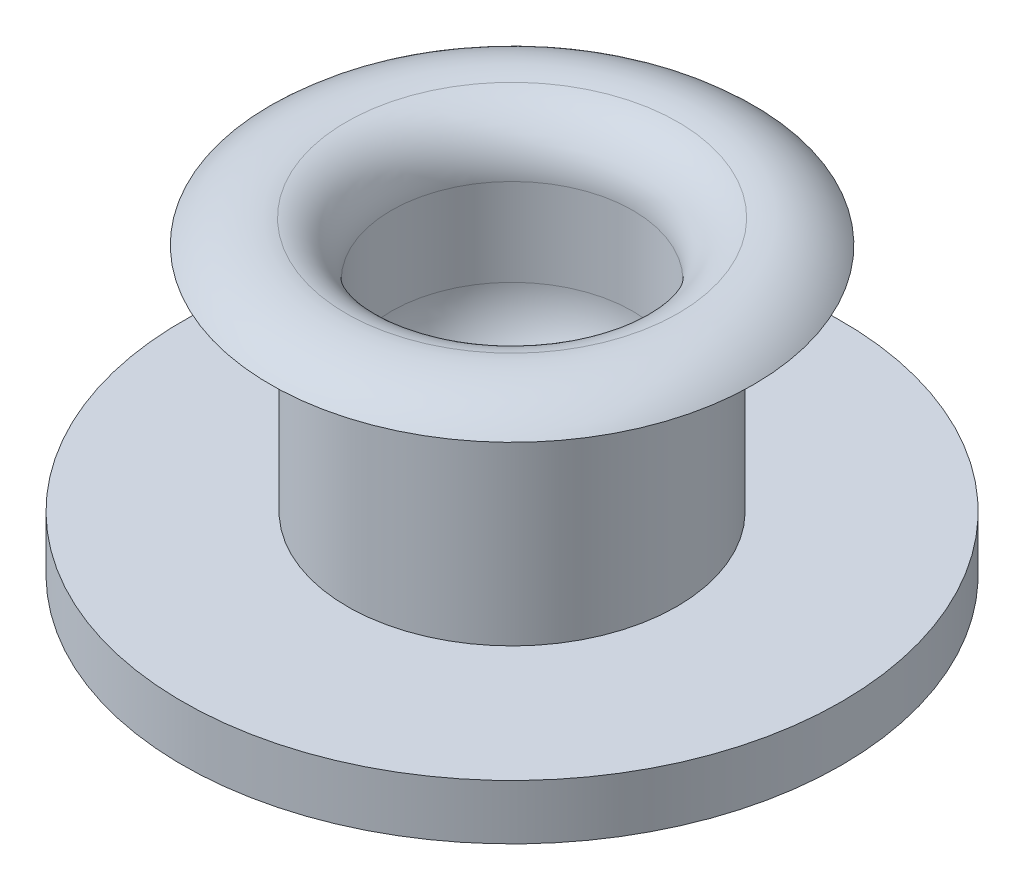
ISO-10303-21;
HEADER;
FILE_DESCRIPTION(('STEP AP214'),'2;1');
FILE_NAME('part.step','',(''),(''),'','','');
FILE_SCHEMA(('AUTOMOTIVE_DESIGN { 1 0 10303 214 1 1 1 1 }'));
ENDSEC;
DATA;
#1=APPLICATION_CONTEXT('core data for automotive mechanical design processes');
#2=APPLICATION_PROTOCOL_DEFINITION('international standard','automotive_design',2000,#1);
#3=PRODUCT_CONTEXT('',#1,'mechanical');
#4=PRODUCT('Part','Part','',(#3));
#5=PRODUCT_RELATED_PRODUCT_CATEGORY('part','',(#4));
#6=PRODUCT_DEFINITION_FORMATION('','',#4);
#7=PRODUCT_DEFINITION_CONTEXT('part definition',#1,'design');
#8=PRODUCT_DEFINITION('design','',#6,#7);
#9=PRODUCT_DEFINITION_SHAPE('','',#8);
#10=(LENGTH_UNIT() NAMED_UNIT(*) SI_UNIT(.MILLI.,.METRE.));
#11=(NAMED_UNIT(*) PLANE_ANGLE_UNIT() SI_UNIT($,.RADIAN.));
#12=(NAMED_UNIT(*) SI_UNIT($,.STERADIAN.) SOLID_ANGLE_UNIT());
#13=UNCERTAINTY_MEASURE_WITH_UNIT(LENGTH_MEASURE(1.E-05),#10,'distance_accuracy_value','');
#14=(GEOMETRIC_REPRESENTATION_CONTEXT(3) GLOBAL_UNCERTAINTY_ASSIGNED_CONTEXT((#13)) GLOBAL_UNIT_ASSIGNED_CONTEXT((#10,
#11,#12)) REPRESENTATION_CONTEXT('',''));
#15=CARTESIAN_POINT('',(0.,0.,0.));
#16=DIRECTION('',(0.,0.,1.));
#17=DIRECTION('',(1.,0.,0.));
#18=AXIS2_PLACEMENT_3D('',#15,#16,#17);
#19=CARTESIAN_POINT('',(0.,-1.1,0.));
#20=DIRECTION('',(0.,-1.,0.));
#21=DIRECTION('',(1.,0.,0.));
#22=AXIS2_PLACEMENT_3D('',#19,#20,#21);
#23=CYLINDRICAL_SURFACE('',#22,1.5);
#24=CARTESIAN_POINT('',(0.,-1.10000000000001,0.));
#25=DIRECTION('',(0.,-1.,0.));
#26=DIRECTION('',(1.,0.,0.));
#27=AXIS2_PLACEMENT_3D('',#24,#25,#26);
#28=CIRCLE('',#27,1.49999999999999);
#29=CARTESIAN_POINT('',(1.49999999999998,-1.10000000000001,0.));
#30=VERTEX_POINT('',#29);
#31=EDGE_CURVE('E87',#30,#30,#28,.T.);
#32=ORIENTED_EDGE('',*,*,#31,.F.);
#33=EDGE_LOOP('',(#32));
#34=FACE_BOUND('',#33,.T.);
#35=CARTESIAN_POINT('',(0.,0.999999999999993,0.));
#36=DIRECTION('',(0.,-1.,0.));
#37=DIRECTION('',(1.,0.,0.));
#38=AXIS2_PLACEMENT_3D('',#35,#36,#37);
#39=CIRCLE('',#38,1.5);
#40=CARTESIAN_POINT('',(1.5,0.999999999999986,0.));
#41=VERTEX_POINT('',#40);
#42=EDGE_CURVE('E83',#41,#41,#39,.T.);
#43=ORIENTED_EDGE('',*,*,#42,.T.);
#44=EDGE_LOOP('',(#43));
#45=FACE_BOUND('',#44,.T.);
#46=ADVANCED_FACE('F34',(#34,#45),#23,.T.);
#47=CARTESIAN_POINT('',(-1.5,0.999999999999998,0.));
#48=DIRECTION('',(0.,1.,0.));
#49=DIRECTION('',(-1.,0.,0.));
#50=AXIS2_PLACEMENT_3D('',#47,#48,#49);
#51=PLANE('',#50);
#52=ORIENTED_EDGE('',*,*,#42,.F.);
#53=EDGE_LOOP('',(#52));
#54=FACE_BOUND('',#53,.T.);
#55=CARTESIAN_POINT('',(0.,0.99999999999999,0.));
#56=DIRECTION('',(0.,-1.,0.));
#57=DIRECTION('',(1.,0.,0.));
#58=AXIS2_PLACEMENT_3D('',#55,#56,#57);
#59=CIRCLE('',#58,2.2);
#60=CARTESIAN_POINT('',(2.2,0.999999999999979,0.));
#61=VERTEX_POINT('',#60);
#62=EDGE_CURVE('E81',#61,#61,#59,.T.);
#63=ORIENTED_EDGE('',*,*,#62,.T.);
#64=EDGE_LOOP('',(#63));
#65=FACE_BOUND('',#64,.T.);
#66=ADVANCED_FACE('F61',(#54,#65),#51,.F.);
#67=CARTESIAN_POINT('',(0.,0.449512890789922,0.));
#68=DIRECTION('',(0.,-1.,0.));
#69=DIRECTION('',(1.,0.,0.));
#70=AXIS2_PLACEMENT_3D('',#67,#68,#69);
#71=TOROIDAL_SURFACE('',#70,1.65,0.778161973760257);
#72=CARTESIAN_POINT('',(0.,1.21500021796986,0.));
#73=DIRECTION('',(0.,-1.,0.));
#74=DIRECTION('',(1.,0.,0.));
#75=AXIS2_PLACEMENT_3D('',#72,#73,#74);
#76=CIRCLE('',#75,1.51012430756783);
#77=CARTESIAN_POINT('',(1.51012430756783,1.21500021796985,0.));
#78=VERTEX_POINT('',#77);
#79=EDGE_CURVE('E41',#78,#78,#76,.T.);
#80=ORIENTED_EDGE('',*,*,#79,.T.);
#81=EDGE_LOOP('',(#80));
#82=FACE_BOUND('',#81,.T.);
#83=ORIENTED_EDGE('',*,*,#62,.F.);
#84=EDGE_LOOP('',(#83));
#85=FACE_BOUND('',#84,.T.);
#86=ADVANCED_FACE('F55',(#82,#85),#71,.T.);
#87=CARTESIAN_POINT('',(0.,-1.1,0.));
#88=DIRECTION('',(0.,-1.,0.));
#89=DIRECTION('',(1.,0.,0.));
#90=AXIS2_PLACEMENT_3D('',#87,#88,#89);
#91=CYLINDRICAL_SURFACE('',#90,1.1);
#92=CARTESIAN_POINT('',(0.,0.723144182213623,0.));
#93=DIRECTION('',(0.,1.,0.));
#94=DIRECTION('',(-1.,0.,0.));
#95=AXIS2_PLACEMENT_3D('',#92,#93,#94);
#96=CIRCLE('',#95,1.1);
#97=CARTESIAN_POINT('',(-1.1,0.723144182213628,0.));
#98=VERTEX_POINT('',#97);
#99=EDGE_CURVE('E11',#98,#98,#96,.T.);
#100=ORIENTED_EDGE('',*,*,#99,.T.);
#101=EDGE_LOOP('',(#100));
#102=FACE_BOUND('',#101,.T.);
#103=CARTESIAN_POINT('',(0.,-0.0718080687841533,0.));
#104=DIRECTION('',(0.,-1.,0.));
#105=DIRECTION('',(1.,0.,0.));
#106=AXIS2_PLACEMENT_3D('',#103,#104,#105);
#107=CIRCLE('',#106,1.1);
#108=CARTESIAN_POINT('',(1.09999999999999,-0.0718080687841585,0.));
#109=VERTEX_POINT('',#108);
#110=EDGE_CURVE('E96',#109,#109,#107,.T.);
#111=ORIENTED_EDGE('',*,*,#110,.T.);
#112=EDGE_LOOP('',(#111));
#113=FACE_BOUND('',#112,.T.);
#114=ADVANCED_FACE('F47',(#102,#113),#91,.F.);
#115=CARTESIAN_POINT('',(0.,-0.92495187368224,0.));
#116=DIRECTION('',(0.,1.,0.));
#117=DIRECTION('',(-1.,0.,0.));
#118=AXIS2_PLACEMENT_3D('',#115,#116,#117);
#119=CONICAL_SURFACE('',#118,0.,1.42379335263982);
#120=CARTESIAN_POINT('',(0.,-0.863179674033902,0.));
#121=DIRECTION('',(0.,1.,0.));
#122=DIRECTION('',(-1.,0.,0.));
#123=AXIS2_PLACEMENT_3D('',#120,#121,#122);
#124=CIRCLE('',#123,0.417179274636923);
#125=CARTESIAN_POINT('',(-0.417179274636932,-0.8631796740339,0.));
#126=VERTEX_POINT('',#125);
#127=EDGE_CURVE('E99',#126,#126,#124,.T.);
#128=ORIENTED_EDGE('',*,*,#127,.T.);
#129=EDGE_LOOP('',(#128));
#130=FACE_BOUND('',#129,.T.);
#131=CARTESIAN_POINT('',(0.,-0.92495187368224,0.));
#132=VERTEX_POINT('',#131);
#133=VERTEX_LOOP('',#132);
#134=FACE_BOUND('',#133,.T.);
#135=ADVANCED_FACE('F44',(#130,#134),#119,.F.);
#136=CARTESIAN_POINT('',(0.,-0.071808068784153,0.));
#137=DIRECTION('',(0.,-1.,0.));
#138=DIRECTION('',(1.,0.,0.));
#139=AXIS2_PLACEMENT_3D('',#136,#137,#138);
#140=DEGENERATE_TOROIDAL_SURFACE('',#139,0.299999999999996,0.8,.T.);
#141=ORIENTED_EDGE('',*,*,#127,.F.);
#142=EDGE_LOOP('',(#141));
#143=FACE_BOUND('',#142,.T.);
#144=ORIENTED_EDGE('',*,*,#110,.F.);
#145=EDGE_LOOP('',(#144));
#146=FACE_BOUND('',#145,.T.);
#147=ADVANCED_FACE('F46',(#143,#146),#140,.F.);
#148=CARTESIAN_POINT('',(0.,0.723144182213623,0.));
#149=DIRECTION('',(0.,1.,0.));
#150=DIRECTION('',(-1.,0.,0.));
#151=AXIS2_PLACEMENT_3D('',#148,#149,#150);
#152=TOROIDAL_SURFACE('',#151,1.6,0.5);
#153=ORIENTED_EDGE('',*,*,#99,.F.);
#154=EDGE_LOOP('',(#153));
#155=FACE_BOUND('',#154,.T.);
#156=ORIENTED_EDGE('',*,*,#79,.F.);
#157=EDGE_LOOP('',(#156));
#158=FACE_BOUND('',#157,.T.);
#159=ADVANCED_FACE('F36',(#155,#158),#152,.T.);
#160=CARTESIAN_POINT('',(0.,-1.6,0.));
#161=DIRECTION('',(0.,1.,0.));
#162=DIRECTION('',(-1.,0.,0.));
#163=AXIS2_PLACEMENT_3D('',#160,#161,#162);
#164=CYLINDRICAL_SURFACE('',#163,3.);
#165=CARTESIAN_POINT('',(0.,-1.6,0.));
#166=DIRECTION('',(0.,-1.,0.));
#167=DIRECTION('',(1.,0.,0.));
#168=AXIS2_PLACEMENT_3D('',#165,#166,#167);
#169=CIRCLE('',#168,3.);
#170=CARTESIAN_POINT('',(2.99999999999999,-1.60000000000001,0.));
#171=VERTEX_POINT('',#170);
#172=EDGE_CURVE('E84',#171,#171,#169,.T.);
#173=ORIENTED_EDGE('',*,*,#172,.F.);
#174=EDGE_LOOP('',(#173));
#175=FACE_BOUND('',#174,.T.);
#176=CARTESIAN_POINT('',(0.,-1.1,0.));
#177=DIRECTION('',(0.,-1.,0.));
#178=DIRECTION('',(1.,0.,0.));
#179=AXIS2_PLACEMENT_3D('',#176,#177,#178);
#180=CIRCLE('',#179,3.);
#181=CARTESIAN_POINT('',(3.,-1.10000000000001,0.));
#182=VERTEX_POINT('',#181);
#183=EDGE_CURVE('E90',#182,#182,#180,.T.);
#184=ORIENTED_EDGE('',*,*,#183,.T.);
#185=EDGE_LOOP('',(#184));
#186=FACE_BOUND('',#185,.T.);
#187=ADVANCED_FACE('F113',(#175,#186),#164,.T.);
#188=CARTESIAN_POINT('',(0.,-1.6,0.));
#189=DIRECTION('',(0.,-1.,0.));
#190=DIRECTION('',(1.,0.,0.));
#191=AXIS2_PLACEMENT_3D('',#188,#189,#190);
#192=PLANE('',#191);
#193=ORIENTED_EDGE('',*,*,#172,.T.);
#194=EDGE_LOOP('',(#193));
#195=FACE_BOUND('',#194,.T.);
#196=ADVANCED_FACE('F108',(#195),#192,.T.);
#197=CARTESIAN_POINT('',(0.,-1.1,0.));
#198=DIRECTION('',(0.,-1.,0.));
#199=DIRECTION('',(1.,0.,0.));
#200=AXIS2_PLACEMENT_3D('',#197,#198,#199);
#201=PLANE('',#200);
#202=ORIENTED_EDGE('',*,*,#31,.T.);
#203=EDGE_LOOP('',(#202));
#204=FACE_BOUND('',#203,.T.);
#205=ORIENTED_EDGE('',*,*,#183,.F.);
#206=EDGE_LOOP('',(#205));
#207=FACE_BOUND('',#206,.T.);
#208=ADVANCED_FACE('F105',(#204,#207),#201,.F.);
#209=CLOSED_SHELL('',(#46,#66,#86,#114,#135,#147,#159,#187,#196,#208));
#210=MANIFOLD_SOLID_BREP('B2',#209);
#211=ADVANCED_BREP_SHAPE_REPRESENTATION('',(#18,#210),#14);
#212=SHAPE_DEFINITION_REPRESENTATION(#9,#211);
ENDSEC;
END-ISO-10303-21;
